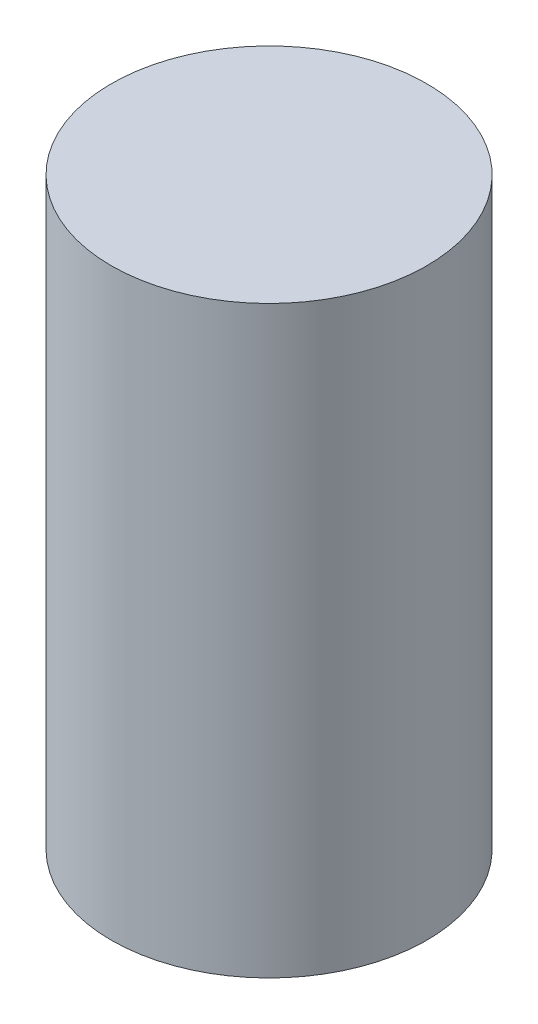
ISO-10303-21;
HEADER;
FILE_DESCRIPTION(('STEP AP214'),'2;1');
FILE_NAME('part.step','',(''),(''),'','','');
FILE_SCHEMA(('AUTOMOTIVE_DESIGN { 1 0 10303 214 1 1 1 1 }'));
ENDSEC;
DATA;
#1=APPLICATION_CONTEXT('core data for automotive mechanical design processes');
#2=APPLICATION_PROTOCOL_DEFINITION('international standard','automotive_design',2000,#1);
#3=PRODUCT_CONTEXT('',#1,'mechanical');
#4=PRODUCT('Part','Part','',(#3));
#5=PRODUCT_RELATED_PRODUCT_CATEGORY('part','',(#4));
#6=PRODUCT_DEFINITION_FORMATION('','',#4);
#7=PRODUCT_DEFINITION_CONTEXT('part definition',#1,'design');
#8=PRODUCT_DEFINITION('design','',#6,#7);
#9=PRODUCT_DEFINITION_SHAPE('','',#8);
#10=(LENGTH_UNIT() NAMED_UNIT(*) SI_UNIT(.MILLI.,.METRE.));
#11=(NAMED_UNIT(*) PLANE_ANGLE_UNIT() SI_UNIT($,.RADIAN.));
#12=(NAMED_UNIT(*) SI_UNIT($,.STERADIAN.) SOLID_ANGLE_UNIT());
#13=UNCERTAINTY_MEASURE_WITH_UNIT(LENGTH_MEASURE(1.E-05),#10,'distance_accuracy_value','');
#14=(GEOMETRIC_REPRESENTATION_CONTEXT(3) GLOBAL_UNCERTAINTY_ASSIGNED_CONTEXT((#13)) GLOBAL_UNIT_ASSIGNED_CONTEXT((#10,
#11,#12)) REPRESENTATION_CONTEXT('',''));
#15=CARTESIAN_POINT('',(0.,0.,0.));
#16=DIRECTION('',(0.,0.,1.));
#17=DIRECTION('',(1.,0.,0.));
#18=AXIS2_PLACEMENT_3D('',#15,#16,#17);
#19=CARTESIAN_POINT('',(0.,50.,0.));
#20=DIRECTION('',(0.,-1.,0.));
#21=DIRECTION('',(0.,0.,-1.));
#22=AXIS2_PLACEMENT_3D('',#19,#20,#21);
#23=CYLINDRICAL_SURFACE('',#22,13.5);
#24=CARTESIAN_POINT('',(0.,50.,0.));
#25=DIRECTION('',(0.,1.,0.));
#26=DIRECTION('',(0.,0.,1.));
#27=AXIS2_PLACEMENT_3D('',#24,#25,#26);
#28=CIRCLE('',#27,13.5);
#29=CARTESIAN_POINT('',(0.,50.,13.5));
#30=VERTEX_POINT('',#29);
#31=EDGE_CURVE('E10',#30,#30,#28,.T.);
#32=ORIENTED_EDGE('',*,*,#31,.F.);
#33=EDGE_LOOP('',(#32));
#34=FACE_BOUND('',#33,.T.);
#35=CARTESIAN_POINT('',(0.,0.,0.));
#36=DIRECTION('',(0.,1.,0.));
#37=DIRECTION('',(0.,0.,1.));
#38=AXIS2_PLACEMENT_3D('',#35,#36,#37);
#39=CIRCLE('',#38,13.5);
#40=CARTESIAN_POINT('',(0.,0.,13.5));
#41=VERTEX_POINT('',#40);
#42=EDGE_CURVE('E34',#41,#41,#39,.T.);
#43=ORIENTED_EDGE('',*,*,#42,.T.);
#44=EDGE_LOOP('',(#43));
#45=FACE_BOUND('',#44,.T.);
#46=ADVANCED_FACE('F31',(#34,#45),#23,.T.);
#47=CARTESIAN_POINT('',(0.,50.,0.));
#48=DIRECTION('',(0.,1.,0.));
#49=DIRECTION('',(0.,0.,1.));
#50=AXIS2_PLACEMENT_3D('',#47,#48,#49);
#51=PLANE('',#50);
#52=ORIENTED_EDGE('',*,*,#31,.T.);
#53=EDGE_LOOP('',(#52));
#54=FACE_BOUND('',#53,.T.);
#55=ADVANCED_FACE('F46',(#54),#51,.T.);
#56=CARTESIAN_POINT('',(0.,0.,0.));
#57=DIRECTION('',(0.,1.,0.));
#58=DIRECTION('',(0.,0.,1.));
#59=AXIS2_PLACEMENT_3D('',#56,#57,#58);
#60=PLANE('',#59);
#61=ORIENTED_EDGE('',*,*,#42,.F.);
#62=EDGE_LOOP('',(#61));
#63=FACE_BOUND('',#62,.T.);
#64=ADVANCED_FACE('F44',(#63),#60,.F.);
#65=CLOSED_SHELL('',(#46,#55,#64));
#66=MANIFOLD_SOLID_BREP('B2',#65);
#67=ADVANCED_BREP_SHAPE_REPRESENTATION('',(#18,#66),#14);
#68=SHAPE_DEFINITION_REPRESENTATION(#9,#67);
ENDSEC;
END-ISO-10303-21;
